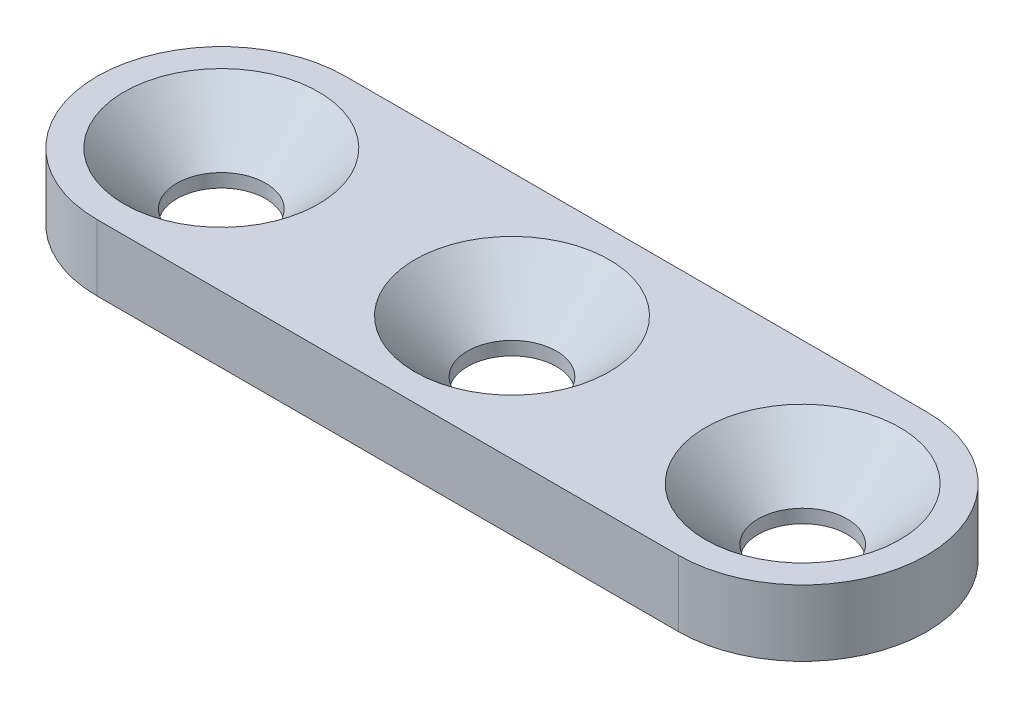
ISO-10303-21;
HEADER;
FILE_DESCRIPTION(('STEP AP214'),'2;1');
FILE_NAME('part.step','',(''),(''),'','','');
FILE_SCHEMA(('AUTOMOTIVE_DESIGN { 1 0 10303 214 1 1 1 1 }'));
ENDSEC;
DATA;
#1=APPLICATION_CONTEXT('core data for automotive mechanical design processes');
#2=APPLICATION_PROTOCOL_DEFINITION('international standard','automotive_design',2000,#1);
#3=PRODUCT_CONTEXT('',#1,'mechanical');
#4=PRODUCT('Part','Part','',(#3));
#5=PRODUCT_RELATED_PRODUCT_CATEGORY('part','',(#4));
#6=PRODUCT_DEFINITION_FORMATION('','',#4);
#7=PRODUCT_DEFINITION_CONTEXT('part definition',#1,'design');
#8=PRODUCT_DEFINITION('design','',#6,#7);
#9=PRODUCT_DEFINITION_SHAPE('','',#8);
#10=(LENGTH_UNIT() NAMED_UNIT(*) SI_UNIT(.MILLI.,.METRE.));
#11=(NAMED_UNIT(*) PLANE_ANGLE_UNIT() SI_UNIT($,.RADIAN.));
#12=(NAMED_UNIT(*) SI_UNIT($,.STERADIAN.) SOLID_ANGLE_UNIT());
#13=UNCERTAINTY_MEASURE_WITH_UNIT(LENGTH_MEASURE(1.E-05),#10,'distance_accuracy_value','');
#14=(GEOMETRIC_REPRESENTATION_CONTEXT(3) GLOBAL_UNCERTAINTY_ASSIGNED_CONTEXT((#13)) GLOBAL_UNIT_ASSIGNED_CONTEXT((#10,
#11,#12)) REPRESENTATION_CONTEXT('',''));
#15=CARTESIAN_POINT('',(0.,0.,0.));
#16=DIRECTION('',(0.,0.,1.));
#17=DIRECTION('',(1.,0.,0.));
#18=AXIS2_PLACEMENT_3D('',#15,#16,#17);
#19=CARTESIAN_POINT('',(14.05,0.,0.));
#20=DIRECTION('',(0.,-1.,0.));
#21=DIRECTION('',(0.,0.,-1.));
#22=AXIS2_PLACEMENT_3D('',#19,#20,#21);
#23=PLANE('',#22);
#24=CARTESIAN_POINT('',(14.05,0.,0.));
#25=DIRECTION('',(0.,1.,0.));
#26=DIRECTION('',(0.,0.,-1.));
#27=AXIS2_PLACEMENT_3D('',#24,#25,#26);
#28=CIRCLE('',#27,6.);
#29=CARTESIAN_POINT('',(14.05,0.,6.));
#30=VERTEX_POINT('',#29);
#31=CARTESIAN_POINT('',(14.05,0.,-6.));
#32=VERTEX_POINT('',#31);
#33=EDGE_CURVE('E126',#30,#32,#28,.T.);
#34=ORIENTED_EDGE('',*,*,#33,.F.);
#35=DIRECTION('',(1.,0.,0.));
#36=VECTOR('',#35,1.);
#37=CARTESIAN_POINT('',(-14.05,0.,6.));
#38=LINE('',#37,#36);
#39=CARTESIAN_POINT('',(-14.05,0.,6.));
#40=VERTEX_POINT('',#39);
#41=EDGE_CURVE('E98',#40,#30,#38,.T.);
#42=ORIENTED_EDGE('',*,*,#41,.F.);
#43=CARTESIAN_POINT('',(-14.05,0.,0.));
#44=DIRECTION('',(0.,1.,0.));
#45=DIRECTION('',(0.,0.,1.));
#46=AXIS2_PLACEMENT_3D('',#43,#44,#45);
#47=CIRCLE('',#46,6.);
#48=CARTESIAN_POINT('',(-14.05,0.,-6.));
#49=VERTEX_POINT('',#48);
#50=EDGE_CURVE('E92',#49,#40,#47,.T.);
#51=ORIENTED_EDGE('',*,*,#50,.F.);
#52=DIRECTION('',(-1.,0.,0.));
#53=VECTOR('',#52,1.);
#54=CARTESIAN_POINT('',(-14.05,0.,-6.));
#55=LINE('',#54,#53);
#56=EDGE_CURVE('E115',#32,#49,#55,.T.);
#57=ORIENTED_EDGE('',*,*,#56,.F.);
#58=EDGE_LOOP('',(#34,#42,#51,#57));
#59=FACE_BOUND('',#58,.T.);
#60=CARTESIAN_POINT('',(-14.05,0.,0.));
#61=DIRECTION('',(0.,1.,0.));
#62=DIRECTION('',(0.,0.,1.));
#63=AXIS2_PLACEMENT_3D('',#60,#61,#62);
#64=CIRCLE('',#63,2.15);
#65=CARTESIAN_POINT('',(-14.05,0.,2.15));
#66=VERTEX_POINT('',#65);
#67=EDGE_CURVE('E130',#66,#66,#64,.T.);
#68=ORIENTED_EDGE('',*,*,#67,.T.);
#69=EDGE_LOOP('',(#68));
#70=FACE_BOUND('',#69,.T.);
#71=CARTESIAN_POINT('',(14.05,0.,0.));
#72=DIRECTION('',(0.,1.,0.));
#73=DIRECTION('',(0.,0.,1.));
#74=AXIS2_PLACEMENT_3D('',#71,#72,#73);
#75=CIRCLE('',#74,2.15);
#76=CARTESIAN_POINT('',(14.05,0.,2.15));
#77=VERTEX_POINT('',#76);
#78=EDGE_CURVE('E158',#77,#77,#75,.T.);
#79=ORIENTED_EDGE('',*,*,#78,.T.);
#80=EDGE_LOOP('',(#79));
#81=FACE_BOUND('',#80,.T.);
#82=CARTESIAN_POINT('',(0.,0.,0.));
#83=DIRECTION('',(0.,1.,0.));
#84=DIRECTION('',(0.,0.,1.));
#85=AXIS2_PLACEMENT_3D('',#82,#83,#84);
#86=CIRCLE('',#85,2.15);
#87=CARTESIAN_POINT('',(0.,0.,2.15));
#88=VERTEX_POINT('',#87);
#89=EDGE_CURVE('E170',#88,#88,#86,.T.);
#90=ORIENTED_EDGE('',*,*,#89,.T.);
#91=EDGE_LOOP('',(#90));
#92=FACE_BOUND('',#91,.T.);
#93=ADVANCED_FACE('F57',(#59,#70,#81,#92),#23,.T.);
#94=CARTESIAN_POINT('',(14.05,3.2,0.));
#95=DIRECTION('',(0.,-1.,0.));
#96=DIRECTION('',(0.,0.,-1.));
#97=AXIS2_PLACEMENT_3D('',#94,#95,#96);
#98=CYLINDRICAL_SURFACE('',#97,6.);
#99=ORIENTED_EDGE('',*,*,#33,.T.);
#100=DIRECTION('',(0.,-1.,0.));
#101=VECTOR('',#100,1.);
#102=CARTESIAN_POINT('',(14.05,3.2,-6.));
#103=LINE('',#102,#101);
#104=CARTESIAN_POINT('',(14.05,3.2,-6.));
#105=VERTEX_POINT('',#104);
#106=EDGE_CURVE('E13',#105,#32,#103,.T.);
#107=ORIENTED_EDGE('',*,*,#106,.F.);
#108=CARTESIAN_POINT('',(14.05,3.2,0.));
#109=DIRECTION('',(0.,1.,0.));
#110=DIRECTION('',(0.,0.,-1.));
#111=AXIS2_PLACEMENT_3D('',#108,#109,#110);
#112=CIRCLE('',#111,6.);
#113=CARTESIAN_POINT('',(14.05,3.2,6.));
#114=VERTEX_POINT('',#113);
#115=EDGE_CURVE('E110',#114,#105,#112,.T.);
#116=ORIENTED_EDGE('',*,*,#115,.F.);
#117=DIRECTION('',(0.,-1.,0.));
#118=VECTOR('',#117,1.);
#119=CARTESIAN_POINT('',(14.05,3.2,6.));
#120=LINE('',#119,#118);
#121=EDGE_CURVE('E122',#114,#30,#120,.T.);
#122=ORIENTED_EDGE('',*,*,#121,.T.);
#123=EDGE_LOOP('',(#99,#107,#116,#122));
#124=FACE_BOUND('',#123,.T.);
#125=ADVANCED_FACE('F59',(#124),#98,.T.);
#126=CARTESIAN_POINT('',(-14.05,3.2,-6.));
#127=DIRECTION('',(0.,0.,1.));
#128=DIRECTION('',(1.,0.,0.));
#129=AXIS2_PLACEMENT_3D('',#126,#127,#128);
#130=PLANE('',#129);
#131=ORIENTED_EDGE('',*,*,#56,.T.);
#132=DIRECTION('',(0.,-1.,0.));
#133=VECTOR('',#132,1.);
#134=CARTESIAN_POINT('',(-14.05,3.2,-6.));
#135=LINE('',#134,#133);
#136=CARTESIAN_POINT('',(-14.05,3.2,-6.));
#137=VERTEX_POINT('',#136);
#138=EDGE_CURVE('E67',#137,#49,#135,.T.);
#139=ORIENTED_EDGE('',*,*,#138,.F.);
#140=DIRECTION('',(-1.,0.,0.));
#141=VECTOR('',#140,1.);
#142=CARTESIAN_POINT('',(-14.05,3.2,-6.));
#143=LINE('',#142,#141);
#144=EDGE_CURVE('E105',#105,#137,#143,.T.);
#145=ORIENTED_EDGE('',*,*,#144,.F.);
#146=ORIENTED_EDGE('',*,*,#106,.T.);
#147=EDGE_LOOP('',(#131,#139,#145,#146));
#148=FACE_BOUND('',#147,.T.);
#149=ADVANCED_FACE('F114',(#148),#130,.F.);
#150=CARTESIAN_POINT('',(-14.05,3.2,0.));
#151=DIRECTION('',(0.,-1.,0.));
#152=DIRECTION('',(0.,0.,-1.));
#153=AXIS2_PLACEMENT_3D('',#150,#151,#152);
#154=CYLINDRICAL_SURFACE('',#153,6.);
#155=ORIENTED_EDGE('',*,*,#50,.T.);
#156=DIRECTION('',(0.,-1.,0.));
#157=VECTOR('',#156,1.);
#158=CARTESIAN_POINT('',(-14.05,3.2,6.));
#159=LINE('',#158,#157);
#160=CARTESIAN_POINT('',(-14.05,3.2,6.));
#161=VERTEX_POINT('',#160);
#162=EDGE_CURVE('E117',#161,#40,#159,.T.);
#163=ORIENTED_EDGE('',*,*,#162,.F.);
#164=CARTESIAN_POINT('',(-14.05,3.2,0.));
#165=DIRECTION('',(0.,1.,0.));
#166=DIRECTION('',(0.,0.,1.));
#167=AXIS2_PLACEMENT_3D('',#164,#165,#166);
#168=CIRCLE('',#167,6.);
#169=EDGE_CURVE('E108',#137,#161,#168,.T.);
#170=ORIENTED_EDGE('',*,*,#169,.F.);
#171=ORIENTED_EDGE('',*,*,#138,.T.);
#172=EDGE_LOOP('',(#155,#163,#170,#171));
#173=FACE_BOUND('',#172,.T.);
#174=ADVANCED_FACE('F118',(#173),#154,.T.);
#175=CARTESIAN_POINT('',(-14.05,3.2,6.));
#176=DIRECTION('',(0.,0.,-1.));
#177=DIRECTION('',(-1.,0.,0.));
#178=AXIS2_PLACEMENT_3D('',#175,#176,#177);
#179=PLANE('',#178);
#180=ORIENTED_EDGE('',*,*,#41,.T.);
#181=ORIENTED_EDGE('',*,*,#121,.F.);
#182=DIRECTION('',(1.,0.,0.));
#183=VECTOR('',#182,1.);
#184=CARTESIAN_POINT('',(-14.05,3.2,6.));
#185=LINE('',#184,#183);
#186=EDGE_CURVE('E75',#161,#114,#185,.T.);
#187=ORIENTED_EDGE('',*,*,#186,.F.);
#188=ORIENTED_EDGE('',*,*,#162,.T.);
#189=EDGE_LOOP('',(#180,#181,#187,#188));
#190=FACE_BOUND('',#189,.T.);
#191=ADVANCED_FACE('F140',(#190),#179,.F.);
#192=CARTESIAN_POINT('',(14.05,3.2,0.));
#193=DIRECTION('',(0.,-1.,0.));
#194=DIRECTION('',(0.,0.,-1.));
#195=AXIS2_PLACEMENT_3D('',#192,#193,#194);
#196=PLANE('',#195);
#197=CARTESIAN_POINT('',(0.,3.2,0.));
#198=DIRECTION('',(0.,1.,0.));
#199=DIRECTION('',(0.,0.,1.));
#200=AXIS2_PLACEMENT_3D('',#197,#198,#199);
#201=CIRCLE('',#200,4.7);
#202=CARTESIAN_POINT('',(0.,3.2,4.7));
#203=VERTEX_POINT('',#202);
#204=EDGE_CURVE('E178',#203,#203,#201,.T.);
#205=ORIENTED_EDGE('',*,*,#204,.F.);
#206=EDGE_LOOP('',(#205));
#207=FACE_BOUND('',#206,.T.);
#208=CARTESIAN_POINT('',(14.05,3.2,0.));
#209=DIRECTION('',(0.,1.,0.));
#210=DIRECTION('',(0.,0.,1.));
#211=AXIS2_PLACEMENT_3D('',#208,#209,#210);
#212=CIRCLE('',#211,4.7);
#213=CARTESIAN_POINT('',(14.05,3.2,4.7));
#214=VERTEX_POINT('',#213);
#215=EDGE_CURVE('E166',#214,#214,#212,.T.);
#216=ORIENTED_EDGE('',*,*,#215,.F.);
#217=EDGE_LOOP('',(#216));
#218=FACE_BOUND('',#217,.T.);
#219=CARTESIAN_POINT('',(-14.05,3.2,0.));
#220=DIRECTION('',(0.,1.,0.));
#221=DIRECTION('',(0.,0.,1.));
#222=AXIS2_PLACEMENT_3D('',#219,#220,#221);
#223=CIRCLE('',#222,4.7);
#224=CARTESIAN_POINT('',(-14.05,3.2,4.7));
#225=VERTEX_POINT('',#224);
#226=EDGE_CURVE('E154',#225,#225,#223,.T.);
#227=ORIENTED_EDGE('',*,*,#226,.F.);
#228=EDGE_LOOP('',(#227));
#229=FACE_BOUND('',#228,.T.);
#230=ORIENTED_EDGE('',*,*,#115,.T.);
#231=ORIENTED_EDGE('',*,*,#144,.T.);
#232=ORIENTED_EDGE('',*,*,#169,.T.);
#233=ORIENTED_EDGE('',*,*,#186,.T.);
#234=EDGE_LOOP('',(#230,#231,#232,#233));
#235=FACE_BOUND('',#234,.T.);
#236=ADVANCED_FACE('F106',(#207,#218,#229,#235),#196,.F.);
#237=CARTESIAN_POINT('',(-14.05,3.2,0.));
#238=DIRECTION('',(0.,1.,0.));
#239=DIRECTION('',(0.,0.,1.));
#240=AXIS2_PLACEMENT_3D('',#237,#238,#239);
#241=CYLINDRICAL_SURFACE('',#240,2.15);
#242=CARTESIAN_POINT('',(-14.05,0.650000000000001,0.));
#243=DIRECTION('',(0.,1.,0.));
#244=DIRECTION('',(0.,0.,1.));
#245=AXIS2_PLACEMENT_3D('',#242,#243,#244);
#246=CIRCLE('',#245,2.15);
#247=CARTESIAN_POINT('',(-14.05,0.650000000000002,2.15));
#248=VERTEX_POINT('',#247);
#249=EDGE_CURVE('E150',#248,#248,#246,.T.);
#250=CARTESIAN_POINT('',(-14.05,0.,2.15));
#251=CARTESIAN_POINT('',(-14.05,0.0067708333333333,2.15));
#252=CARTESIAN_POINT('',(-14.05,0.0135416666666666,2.15));
#253=CARTESIAN_POINT('',(-14.05,0.0270833333333334,2.15));
#254=CARTESIAN_POINT('',(-14.05,0.0338541666666668,2.15));
#255=CARTESIAN_POINT('',(-14.05,0.0473958333333336,2.15));
#256=CARTESIAN_POINT('',(-14.05,0.0541666666666669,2.15));
#257=CARTESIAN_POINT('',(-14.05,0.0677083333333335,2.15));
#258=CARTESIAN_POINT('',(-14.05,0.0744791666666668,2.15));
#259=CARTESIAN_POINT('',(-14.05,0.0880208333333336,2.15));
#260=CARTESIAN_POINT('',(-14.05,0.0947916666666671,2.15));
#261=CARTESIAN_POINT('',(-14.05,0.108333333333334,2.15));
#262=CARTESIAN_POINT('',(-14.05,0.115104166666667,2.15));
#263=CARTESIAN_POINT('',(-14.05,0.128645833333334,2.15));
#264=CARTESIAN_POINT('',(-14.05,0.135416666666667,2.15));
#265=CARTESIAN_POINT('',(-14.05,0.148958333333334,2.15));
#266=CARTESIAN_POINT('',(-14.05,0.155729166666667,2.15));
#267=CARTESIAN_POINT('',(-14.05,0.169270833333334,2.15));
#268=CARTESIAN_POINT('',(-14.05,0.176041666666667,2.15));
#269=CARTESIAN_POINT('',(-14.05,0.189583333333334,2.15));
#270=CARTESIAN_POINT('',(-14.05,0.196354166666667,2.15));
#271=CARTESIAN_POINT('',(-14.05,0.209895833333334,2.15));
#272=CARTESIAN_POINT('',(-14.05,0.216666666666667,2.15));
#273=CARTESIAN_POINT('',(-14.05,0.230208333333334,2.15));
#274=CARTESIAN_POINT('',(-14.05,0.236979166666667,2.15));
#275=CARTESIAN_POINT('',(-14.05,0.250520833333334,2.15));
#276=CARTESIAN_POINT('',(-14.05,0.257291666666668,2.15));
#277=CARTESIAN_POINT('',(-14.05,0.270833333333334,2.15));
#278=CARTESIAN_POINT('',(-14.05,0.277604166666667,2.15));
#279=CARTESIAN_POINT('',(-14.05,0.291145833333334,2.15));
#280=CARTESIAN_POINT('',(-14.05,0.297916666666667,2.15));
#281=CARTESIAN_POINT('',(-14.05,0.311458333333334,2.15));
#282=CARTESIAN_POINT('',(-14.05,0.318229166666667,2.15));
#283=CARTESIAN_POINT('',(-14.05,0.331770833333334,2.15));
#284=CARTESIAN_POINT('',(-14.05,0.338541666666667,2.15));
#285=CARTESIAN_POINT('',(-14.05,0.352083333333334,2.15));
#286=CARTESIAN_POINT('',(-14.05,0.358854166666667,2.15));
#287=CARTESIAN_POINT('',(-14.05,0.372395833333334,2.15));
#288=CARTESIAN_POINT('',(-14.05,0.379166666666668,2.15));
#289=CARTESIAN_POINT('',(-14.05,0.392708333333334,2.15));
#290=CARTESIAN_POINT('',(-14.05,0.399479166666667,2.15));
#291=CARTESIAN_POINT('',(-14.05,0.413020833333334,2.15));
#292=CARTESIAN_POINT('',(-14.05,0.419791666666668,2.15));
#293=CARTESIAN_POINT('',(-14.05,0.433333333333334,2.15));
#294=CARTESIAN_POINT('',(-14.05,0.440104166666668,2.15));
#295=CARTESIAN_POINT('',(-14.05,0.453645833333334,2.15));
#296=CARTESIAN_POINT('',(-14.05,0.460416666666668,2.15));
#297=CARTESIAN_POINT('',(-14.05,0.473958333333334,2.15));
#298=CARTESIAN_POINT('',(-14.05,0.480729166666668,2.15));
#299=CARTESIAN_POINT('',(-14.05,0.494270833333335,2.15));
#300=CARTESIAN_POINT('',(-14.05,0.501041666666668,2.15));
#301=CARTESIAN_POINT('',(-14.05,0.514583333333335,2.15));
#302=CARTESIAN_POINT('',(-14.05,0.521354166666668,2.15));
#303=CARTESIAN_POINT('',(-14.05,0.534895833333335,2.15));
#304=CARTESIAN_POINT('',(-14.05,0.541666666666668,2.15));
#305=CARTESIAN_POINT('',(-14.05,0.555208333333335,2.15));
#306=CARTESIAN_POINT('',(-14.05,0.561979166666668,2.15));
#307=CARTESIAN_POINT('',(-14.05,0.575520833333335,2.15));
#308=CARTESIAN_POINT('',(-14.05,0.582291666666668,2.15));
#309=CARTESIAN_POINT('',(-14.05,0.595833333333335,2.15));
#310=CARTESIAN_POINT('',(-14.05,0.602604166666668,2.15));
#311=CARTESIAN_POINT('',(-14.05,0.616145833333335,2.15));
#312=CARTESIAN_POINT('',(-14.05,0.622916666666668,2.15));
#313=CARTESIAN_POINT('',(-14.05,0.636458333333335,2.15));
#314=CARTESIAN_POINT('',(-14.05,0.643229166666668,2.15));
#315=CARTESIAN_POINT('',(-14.05,0.650000000000002,2.15));
#316=B_SPLINE_CURVE_WITH_KNOTS('',3,(#250,#251,#252,#253,#254,#255,#256,#257,#258,#259,#260,
#261,#262,#263,#264,#265,#266,#267,#268,#269,#270,#271,#272,#273,#274,#275,#276,#277,#278,#279,
#280,#281,#282,#283,#284,#285,#286,#287,#288,#289,#290,#291,#292,#293,#294,#295,#296,#297,#298,
#299,#300,#301,#302,#303,#304,#305,#306,#307,#308,#309,#310,#311,#312,#313,#314,#315),
.UNSPECIFIED.,.F.,.F.,(4,2,2,2,2,2,2,2,2,2,2,2,2,2,2,2,2,2,2,2,2,2,2,2,2,2,2,2,2,2,2,2,4),(0.,
0.0203124999999999,0.0406250000000003,0.0609375000000002,0.0812500000000002,0.101562500000001,
0.121875,0.1421875,0.1625,0.182812500000001,0.203125000000001,0.223437500000001,
0.243750000000001,0.264062500000001,0.284375,0.304687500000001,0.325000000000001,
0.345312500000001,0.365625000000001,0.385937500000001,0.406250000000001,0.426562500000001,
0.446875000000001,0.467187500000001,0.487500000000001,0.507812500000001,0.528125000000001,
0.548437500000002,0.568750000000002,0.589062500000001,0.609375000000002,0.629687500000002,
0.650000000000002),.UNSPECIFIED.);
#317=EDGE_CURVE('BSEAM187',#66,#248,#316,.T.);
#318=ORIENTED_EDGE('',*,*,#67,.F.);
#319=ORIENTED_EDGE('',*,*,#249,.T.);
#320=ORIENTED_EDGE('',*,*,#317,.T.);
#321=ORIENTED_EDGE('',*,*,#317,.F.);
#322=EDGE_LOOP('',(#318,#320,#319,#321));
#323=FACE_BOUND('',#322,.T.);
#324=ADVANCED_FACE('F187',(#323),#241,.F.);
#325=CARTESIAN_POINT('',(-14.05,3.2,0.));
#326=DIRECTION('',(0.,1.,0.));
#327=DIRECTION('',(0.,0.,1.));
#328=AXIS2_PLACEMENT_3D('',#325,#326,#327);
#329=CONICAL_SURFACE('',#328,4.7,0.785398163397448);
#330=CARTESIAN_POINT('',(-14.05,0.650000000000002,2.15));
#331=CARTESIAN_POINT('',(-14.05,0.676562500000002,2.1765625));
#332=CARTESIAN_POINT('',(-14.05,0.703125000000002,2.203125));
#333=CARTESIAN_POINT('',(-14.05,0.756250000000002,2.25625));
#334=CARTESIAN_POINT('',(-14.05,0.782812500000001,2.2828125));
#335=CARTESIAN_POINT('',(-14.05,0.835937500000002,2.3359375));
#336=CARTESIAN_POINT('',(-14.05,0.862500000000001,2.3625));
#337=CARTESIAN_POINT('',(-14.05,0.915625000000001,2.415625));
#338=CARTESIAN_POINT('',(-14.05,0.942187500000001,2.4421875));
#339=CARTESIAN_POINT('',(-14.05,0.995312500000001,2.4953125));
#340=CARTESIAN_POINT('',(-14.05,1.021875,2.521875));
#341=CARTESIAN_POINT('',(-14.05,1.075,2.575));
#342=CARTESIAN_POINT('',(-14.05,1.1015625,2.6015625));
#343=CARTESIAN_POINT('',(-14.05,1.1546875,2.6546875));
#344=CARTESIAN_POINT('',(-14.05,1.18125,2.68125));
#345=CARTESIAN_POINT('',(-14.05,1.234375,2.734375));
#346=CARTESIAN_POINT('',(-14.05,1.2609375,2.7609375));
#347=CARTESIAN_POINT('',(-14.05,1.3140625,2.8140625));
#348=CARTESIAN_POINT('',(-14.05,1.340625,2.840625));
#349=CARTESIAN_POINT('',(-14.05,1.39375,2.89375));
#350=CARTESIAN_POINT('',(-14.05,1.4203125,2.9203125));
#351=CARTESIAN_POINT('',(-14.05,1.4734375,2.9734375));
#352=CARTESIAN_POINT('',(-14.05,1.5,3.));
#353=CARTESIAN_POINT('',(-14.05,1.553125,3.053125));
#354=CARTESIAN_POINT('',(-14.05,1.5796875,3.0796875));
#355=CARTESIAN_POINT('',(-14.05,1.6328125,3.1328125));
#356=CARTESIAN_POINT('',(-14.05,1.659375,3.159375));
#357=CARTESIAN_POINT('',(-14.05,1.7125,3.2125));
#358=CARTESIAN_POINT('',(-14.05,1.7390625,3.2390625));
#359=CARTESIAN_POINT('',(-14.05,1.7921875,3.2921875));
#360=CARTESIAN_POINT('',(-14.05,1.81875,3.31875));
#361=CARTESIAN_POINT('',(-14.05,1.871875,3.371875));
#362=CARTESIAN_POINT('',(-14.05,1.8984375,3.3984375));
#363=CARTESIAN_POINT('',(-14.05,1.9515625,3.4515625));
#364=CARTESIAN_POINT('',(-14.05,1.978125,3.478125));
#365=CARTESIAN_POINT('',(-14.05,2.03125,3.53125));
#366=CARTESIAN_POINT('',(-14.05,2.0578125,3.5578125));
#367=CARTESIAN_POINT('',(-14.05,2.1109375,3.6109375));
#368=CARTESIAN_POINT('',(-14.05,2.1375,3.6375));
#369=CARTESIAN_POINT('',(-14.05,2.190625,3.690625));
#370=CARTESIAN_POINT('',(-14.05,2.2171875,3.7171875));
#371=CARTESIAN_POINT('',(-14.05,2.2703125,3.7703125));
#372=CARTESIAN_POINT('',(-14.05,2.296875,3.796875));
#373=CARTESIAN_POINT('',(-14.05,2.35,3.85));
#374=CARTESIAN_POINT('',(-14.05,2.3765625,3.8765625));
#375=CARTESIAN_POINT('',(-14.05,2.4296875,3.9296875));
#376=CARTESIAN_POINT('',(-14.05,2.45625,3.95625));
#377=CARTESIAN_POINT('',(-14.05,2.509375,4.009375));
#378=CARTESIAN_POINT('',(-14.05,2.5359375,4.0359375));
#379=CARTESIAN_POINT('',(-14.05,2.5890625,4.0890625));
#380=CARTESIAN_POINT('',(-14.05,2.615625,4.115625));
#381=CARTESIAN_POINT('',(-14.05,2.66875,4.16875));
#382=CARTESIAN_POINT('',(-14.05,2.6953125,4.1953125));
#383=CARTESIAN_POINT('',(-14.05,2.7484375,4.2484375));
#384=CARTESIAN_POINT('',(-14.05,2.775,4.275));
#385=CARTESIAN_POINT('',(-14.05,2.828125,4.328125));
#386=CARTESIAN_POINT('',(-14.05,2.8546875,4.3546875));
#387=CARTESIAN_POINT('',(-14.05,2.9078125,4.4078125));
#388=CARTESIAN_POINT('',(-14.05,2.934375,4.434375));
#389=CARTESIAN_POINT('',(-14.05,2.9875,4.4875));
#390=CARTESIAN_POINT('',(-14.05,3.0140625,4.5140625));
#391=CARTESIAN_POINT('',(-14.05,3.0671875,4.5671875));
#392=CARTESIAN_POINT('',(-14.05,3.09375,4.59375));
#393=CARTESIAN_POINT('',(-14.05,3.146875,4.646875));
#394=CARTESIAN_POINT('',(-14.05,3.1734375,4.6734375));
#395=CARTESIAN_POINT('',(-14.05,3.2,4.7));
#396=B_SPLINE_CURVE_WITH_KNOTS('',3,(#330,#331,#332,#333,#334,#335,#336,#337,#338,#339,#340,
#341,#342,#343,#344,#345,#346,#347,#348,#349,#350,#351,#352,#353,#354,#355,#356,#357,#358,#359,
#360,#361,#362,#363,#364,#365,#366,#367,#368,#369,#370,#371,#372,#373,#374,#375,#376,#377,#378,
#379,#380,#381,#382,#383,#384,#385,#386,#387,#388,#389,#390,#391,#392,#393,#394,#395),
.UNSPECIFIED.,.F.,.F.,(4,2,2,2,2,2,2,2,2,2,2,2,2,2,2,2,2,2,2,2,2,2,2,2,2,2,2,2,2,2,2,2,4),(0.,
0.112695143251606,0.225390286503212,0.338085429754818,0.450780573006423,0.563475716258029,
0.676170859509635,0.788866002761241,0.901561146012846,1.01425628926445,1.12695143251606,
1.23964657576766,1.35234171901927,1.46503686227087,1.57773200552248,1.69042714877409,
1.80312229202569,1.9158174352773,2.0285125785289,2.14120772178051,2.25390286503212,
2.36659800828372,2.47929315153533,2.59198829478693,2.70468343803854,2.81737858129014,
2.93007372454175,3.04276886779336,3.15546401104496,3.26815915429657,3.38085429754817,
3.49354944079978,3.60624458405138),.UNSPECIFIED.);
#397=EDGE_CURVE('BSEAM193',#248,#225,#396,.T.);
#398=ORIENTED_EDGE('',*,*,#249,.F.);
#399=ORIENTED_EDGE('',*,*,#226,.T.);
#400=ORIENTED_EDGE('',*,*,#397,.T.);
#401=ORIENTED_EDGE('',*,*,#397,.F.);
#402=EDGE_LOOP('',(#398,#400,#399,#401));
#403=FACE_BOUND('',#402,.T.);
#404=ADVANCED_FACE('F193',(#403),#329,.F.);
#405=CARTESIAN_POINT('',(14.05,3.2,0.));
#406=DIRECTION('',(0.,1.,0.));
#407=DIRECTION('',(0.,0.,1.));
#408=AXIS2_PLACEMENT_3D('',#405,#406,#407);
#409=CYLINDRICAL_SURFACE('',#408,2.15);
#410=CARTESIAN_POINT('',(14.05,0.650000000000001,0.));
#411=DIRECTION('',(0.,1.,0.));
#412=DIRECTION('',(0.,0.,1.));
#413=AXIS2_PLACEMENT_3D('',#410,#411,#412);
#414=CIRCLE('',#413,2.15);
#415=CARTESIAN_POINT('',(14.05,0.650000000000002,2.15));
#416=VERTEX_POINT('',#415);
#417=EDGE_CURVE('E162',#416,#416,#414,.T.);
#418=CARTESIAN_POINT('',(14.05,0.,2.15));
#419=CARTESIAN_POINT('',(14.05,0.00677083333332651,2.15));
#420=CARTESIAN_POINT('',(14.05,0.01354166666666,2.15));
#421=CARTESIAN_POINT('',(14.05,0.0270833333333269,2.15));
#422=CARTESIAN_POINT('',(14.05,0.0338541666666603,2.15));
#423=CARTESIAN_POINT('',(14.05,0.0473958333333271,2.15));
#424=CARTESIAN_POINT('',(14.05,0.0541666666666604,2.15));
#425=CARTESIAN_POINT('',(14.05,0.0677083333333272,2.15));
#426=CARTESIAN_POINT('',(14.05,0.0744791666666606,2.15));
#427=CARTESIAN_POINT('',(14.05,0.0880208333333275,2.15));
#428=CARTESIAN_POINT('',(14.05,0.094791666666661,2.15));
#429=CARTESIAN_POINT('',(14.05,0.108333333333328,2.15));
#430=CARTESIAN_POINT('',(14.05,0.115104166666661,2.15));
#431=CARTESIAN_POINT('',(14.05,0.128645833333328,2.15));
#432=CARTESIAN_POINT('',(14.05,0.135416666666662,2.15));
#433=CARTESIAN_POINT('',(14.05,0.148958333333329,2.15));
#434=CARTESIAN_POINT('',(14.05,0.155729166666662,2.15));
#435=CARTESIAN_POINT('',(14.05,0.169270833333329,2.15));
#436=CARTESIAN_POINT('',(14.05,0.176041666666662,2.15));
#437=CARTESIAN_POINT('',(14.05,0.189583333333329,2.15));
#438=CARTESIAN_POINT('',(14.05,0.196354166666662,2.15));
#439=CARTESIAN_POINT('',(14.05,0.209895833333329,2.15));
#440=CARTESIAN_POINT('',(14.05,0.216666666666663,2.15));
#441=CARTESIAN_POINT('',(14.05,0.23020833333333,2.15));
#442=CARTESIAN_POINT('',(14.05,0.236979166666663,2.15));
#443=CARTESIAN_POINT('',(14.05,0.25052083333333,2.15));
#444=CARTESIAN_POINT('',(14.05,0.257291666666663,2.15));
#445=CARTESIAN_POINT('',(14.05,0.27083333333333,2.15));
#446=CARTESIAN_POINT('',(14.05,0.277604166666663,2.15));
#447=CARTESIAN_POINT('',(14.05,0.29114583333333,2.15));
#448=CARTESIAN_POINT('',(14.05,0.297916666666663,2.15));
#449=CARTESIAN_POINT('',(14.05,0.31145833333333,2.15));
#450=CARTESIAN_POINT('',(14.05,0.318229166666664,2.15));
#451=CARTESIAN_POINT('',(14.05,0.331770833333331,2.15));
#452=CARTESIAN_POINT('',(14.05,0.338541666666664,2.15));
#453=CARTESIAN_POINT('',(14.05,0.352083333333331,2.15));
#454=CARTESIAN_POINT('',(14.05,0.358854166666664,2.15));
#455=CARTESIAN_POINT('',(14.05,0.372395833333331,2.15));
#456=CARTESIAN_POINT('',(14.05,0.379166666666665,2.15));
#457=CARTESIAN_POINT('',(14.05,0.392708333333331,2.15));
#458=CARTESIAN_POINT('',(14.05,0.399479166666665,2.15));
#459=CARTESIAN_POINT('',(14.05,0.413020833333332,2.15));
#460=CARTESIAN_POINT('',(14.05,0.419791666666665,2.15));
#461=CARTESIAN_POINT('',(14.05,0.433333333333332,2.15));
#462=CARTESIAN_POINT('',(14.05,0.440104166666665,2.15));
#463=CARTESIAN_POINT('',(14.05,0.453645833333332,2.15));
#464=CARTESIAN_POINT('',(14.05,0.460416666666666,2.15));
#465=CARTESIAN_POINT('',(14.05,0.473958333333333,2.15));
#466=CARTESIAN_POINT('',(14.05,0.480729166666666,2.15));
#467=CARTESIAN_POINT('',(14.05,0.494270833333333,2.15));
#468=CARTESIAN_POINT('',(14.05,0.501041666666666,2.15));
#469=CARTESIAN_POINT('',(14.05,0.514583333333333,2.15));
#470=CARTESIAN_POINT('',(14.05,0.521354166666666,2.15));
#471=CARTESIAN_POINT('',(14.05,0.534895833333333,2.15));
#472=CARTESIAN_POINT('',(14.05,0.541666666666667,2.15));
#473=CARTESIAN_POINT('',(14.05,0.555208333333334,2.15));
#474=CARTESIAN_POINT('',(14.05,0.561979166666667,2.15));
#475=CARTESIAN_POINT('',(14.05,0.575520833333334,2.15));
#476=CARTESIAN_POINT('',(14.05,0.582291666666667,2.15));
#477=CARTESIAN_POINT('',(14.05,0.595833333333334,2.15));
#478=CARTESIAN_POINT('',(14.05,0.602604166666667,2.15));
#479=CARTESIAN_POINT('',(14.05,0.616145833333334,2.15));
#480=CARTESIAN_POINT('',(14.05,0.622916666666668,2.15));
#481=CARTESIAN_POINT('',(14.05,0.636458333333335,2.15));
#482=CARTESIAN_POINT('',(14.05,0.643229166666668,2.15));
#483=CARTESIAN_POINT('',(14.05,0.650000000000002,2.15));
#484=B_SPLINE_CURVE_WITH_KNOTS('',3,(#418,#419,#420,#421,#422,#423,#424,#425,#426,#427,#428,
#429,#430,#431,#432,#433,#434,#435,#436,#437,#438,#439,#440,#441,#442,#443,#444,#445,#446,#447,
#448,#449,#450,#451,#452,#453,#454,#455,#456,#457,#458,#459,#460,#461,#462,#463,#464,#465,#466,
#467,#468,#469,#470,#471,#472,#473,#474,#475,#476,#477,#478,#479,#480,#481,#482,#483),
.UNSPECIFIED.,.F.,.F.,(4,2,2,2,2,2,2,2,2,2,2,2,2,2,2,2,2,2,2,2,2,2,2,2,2,2,2,2,2,2,2,2,4),(0.,
0.0203125000000004,0.0406250000000007,0.0609375000000007,0.081250000000001,0.101562500000001,
0.121875000000002,0.142187500000002,0.162500000000002,0.182812500000002,0.203125000000003,
0.223437500000003,0.243750000000004,0.264062500000004,0.284375000000003,0.304687500000004,
0.325000000000004,0.345312500000004,0.365625000000005,0.385937500000005,0.406250000000005,
0.426562500000006,0.446875000000006,0.467187500000006,0.487500000000007,0.507812500000007,
0.528125000000007,0.548437500000007,0.568750000000008,0.589062500000008,0.609375000000008,
0.629687500000008,0.650000000000009),.UNSPECIFIED.);
#485=EDGE_CURVE('BSEAM195',#77,#416,#484,.T.);
#486=ORIENTED_EDGE('',*,*,#78,.F.);
#487=ORIENTED_EDGE('',*,*,#417,.T.);
#488=ORIENTED_EDGE('',*,*,#485,.T.);
#489=ORIENTED_EDGE('',*,*,#485,.F.);
#490=EDGE_LOOP('',(#486,#488,#487,#489));
#491=FACE_BOUND('',#490,.T.);
#492=ADVANCED_FACE('F195',(#491),#409,.F.);
#493=CARTESIAN_POINT('',(14.05,3.2,0.));
#494=DIRECTION('',(0.,1.,0.));
#495=DIRECTION('',(0.,0.,1.));
#496=AXIS2_PLACEMENT_3D('',#493,#494,#495);
#497=CONICAL_SURFACE('',#496,4.7,0.785398163397448);
#498=CARTESIAN_POINT('',(14.05,0.650000000000002,2.15000000000001));
#499=CARTESIAN_POINT('',(14.05,0.676562500000002,2.17656250000001));
#500=CARTESIAN_POINT('',(14.05,0.703125000000002,2.20312500000001));
#501=CARTESIAN_POINT('',(14.05,0.756250000000002,2.25625000000001));
#502=CARTESIAN_POINT('',(14.05,0.782812500000001,2.28281250000001));
#503=CARTESIAN_POINT('',(14.05,0.835937500000002,2.33593750000001));
#504=CARTESIAN_POINT('',(14.05,0.862500000000001,2.36250000000001));
#505=CARTESIAN_POINT('',(14.05,0.915625000000001,2.41562500000001));
#506=CARTESIAN_POINT('',(14.05,0.942187500000001,2.44218750000001));
#507=CARTESIAN_POINT('',(14.05,0.995312500000001,2.49531250000001));
#508=CARTESIAN_POINT('',(14.05,1.021875,2.52187500000001));
#509=CARTESIAN_POINT('',(14.05,1.075,2.57500000000001));
#510=CARTESIAN_POINT('',(14.05,1.1015625,2.60156250000001));
#511=CARTESIAN_POINT('',(14.05,1.1546875,2.65468750000001));
#512=CARTESIAN_POINT('',(14.05,1.18125,2.68125000000001));
#513=CARTESIAN_POINT('',(14.05,1.234375,2.73437500000001));
#514=CARTESIAN_POINT('',(14.05,1.2609375,2.76093750000001));
#515=CARTESIAN_POINT('',(14.05,1.3140625,2.81406250000001));
#516=CARTESIAN_POINT('',(14.05,1.340625,2.84062500000001));
#517=CARTESIAN_POINT('',(14.05,1.39375,2.89375));
#518=CARTESIAN_POINT('',(14.05,1.4203125,2.9203125));
#519=CARTESIAN_POINT('',(14.05,1.4734375,2.9734375));
#520=CARTESIAN_POINT('',(14.05,1.5,3.));
#521=CARTESIAN_POINT('',(14.05,1.553125,3.053125));
#522=CARTESIAN_POINT('',(14.05,1.5796875,3.0796875));
#523=CARTESIAN_POINT('',(14.05,1.6328125,3.1328125));
#524=CARTESIAN_POINT('',(14.05,1.659375,3.159375));
#525=CARTESIAN_POINT('',(14.05,1.7125,3.2125));
#526=CARTESIAN_POINT('',(14.05,1.7390625,3.2390625));
#527=CARTESIAN_POINT('',(14.05,1.7921875,3.2921875));
#528=CARTESIAN_POINT('',(14.05,1.81875,3.31875));
#529=CARTESIAN_POINT('',(14.05,1.871875,3.371875));
#530=CARTESIAN_POINT('',(14.05,1.8984375,3.3984375));
#531=CARTESIAN_POINT('',(14.05,1.9515625,3.4515625));
#532=CARTESIAN_POINT('',(14.05,1.978125,3.478125));
#533=CARTESIAN_POINT('',(14.05,2.03125,3.53125));
#534=CARTESIAN_POINT('',(14.05,2.0578125,3.5578125));
#535=CARTESIAN_POINT('',(14.05,2.1109375,3.6109375));
#536=CARTESIAN_POINT('',(14.05,2.1375,3.6375));
#537=CARTESIAN_POINT('',(14.05,2.190625,3.690625));
#538=CARTESIAN_POINT('',(14.05,2.2171875,3.7171875));
#539=CARTESIAN_POINT('',(14.05,2.2703125,3.7703125));
#540=CARTESIAN_POINT('',(14.05,2.296875,3.796875));
#541=CARTESIAN_POINT('',(14.05,2.35,3.85));
#542=CARTESIAN_POINT('',(14.05,2.3765625,3.8765625));
#543=CARTESIAN_POINT('',(14.05,2.4296875,3.9296875));
#544=CARTESIAN_POINT('',(14.05,2.45625,3.95625));
#545=CARTESIAN_POINT('',(14.05,2.509375,4.009375));
#546=CARTESIAN_POINT('',(14.05,2.5359375,4.0359375));
#547=CARTESIAN_POINT('',(14.05,2.5890625,4.0890625));
#548=CARTESIAN_POINT('',(14.05,2.615625,4.115625));
#549=CARTESIAN_POINT('',(14.05,2.66875,4.16875));
#550=CARTESIAN_POINT('',(14.05,2.6953125,4.1953125));
#551=CARTESIAN_POINT('',(14.05,2.7484375,4.2484375));
#552=CARTESIAN_POINT('',(14.05,2.775,4.275));
#553=CARTESIAN_POINT('',(14.05,2.828125,4.328125));
#554=CARTESIAN_POINT('',(14.05,2.8546875,4.3546875));
#555=CARTESIAN_POINT('',(14.05,2.9078125,4.4078125));
#556=CARTESIAN_POINT('',(14.05,2.934375,4.434375));
#557=CARTESIAN_POINT('',(14.05,2.9875,4.4875));
#558=CARTESIAN_POINT('',(14.05,3.0140625,4.5140625));
#559=CARTESIAN_POINT('',(14.05,3.0671875,4.5671875));
#560=CARTESIAN_POINT('',(14.05,3.09375,4.59375));
#561=CARTESIAN_POINT('',(14.05,3.146875,4.646875));
#562=CARTESIAN_POINT('',(14.05,3.1734375,4.6734375));
#563=CARTESIAN_POINT('',(14.05,3.2,4.7));
#564=B_SPLINE_CURVE_WITH_KNOTS('',3,(#498,#499,#500,#501,#502,#503,#504,#505,#506,#507,#508,
#509,#510,#511,#512,#513,#514,#515,#516,#517,#518,#519,#520,#521,#522,#523,#524,#525,#526,#527,
#528,#529,#530,#531,#532,#533,#534,#535,#536,#537,#538,#539,#540,#541,#542,#543,#544,#545,#546,
#547,#548,#549,#550,#551,#552,#553,#554,#555,#556,#557,#558,#559,#560,#561,#562,#563),
.UNSPECIFIED.,.F.,.F.,(4,2,2,2,2,2,2,2,2,2,2,2,2,2,2,2,2,2,2,2,2,2,2,2,2,2,2,2,2,2,2,2,4),(0.,
0.112695143251606,0.225390286503212,0.338085429754818,0.450780573006423,0.56347571625803,
0.676170859509636,0.788866002761242,0.901561146012848,1.01425628926445,1.12695143251606,
1.23964657576767,1.35234171901927,1.46503686227088,1.57773200552248,1.69042714877409,
1.80312229202569,1.9158174352773,2.02851257852891,2.14120772178051,2.25390286503212,
2.36659800828372,2.47929315153533,2.59198829478694,2.70468343803854,2.81737858129015,
2.93007372454175,3.04276886779336,3.15546401104497,3.26815915429657,3.38085429754818,
3.49354944079978,3.60624458405139),.UNSPECIFIED.);
#565=EDGE_CURVE('BSEAM203',#416,#214,#564,.T.);
#566=ORIENTED_EDGE('',*,*,#417,.F.);
#567=ORIENTED_EDGE('',*,*,#215,.T.);
#568=ORIENTED_EDGE('',*,*,#565,.T.);
#569=ORIENTED_EDGE('',*,*,#565,.F.);
#570=EDGE_LOOP('',(#566,#568,#567,#569));
#571=FACE_BOUND('',#570,.T.);
#572=ADVANCED_FACE('F203',(#571),#497,.F.);
#573=CARTESIAN_POINT('',(0.,3.2,0.));
#574=DIRECTION('',(0.,1.,0.));
#575=DIRECTION('',(0.,0.,1.));
#576=AXIS2_PLACEMENT_3D('',#573,#574,#575);
#577=CYLINDRICAL_SURFACE('',#576,2.15);
#578=CARTESIAN_POINT('',(0.,0.649999999999994,0.));
#579=DIRECTION('',(0.,1.,0.));
#580=DIRECTION('',(0.,0.,1.));
#581=AXIS2_PLACEMENT_3D('',#578,#579,#580);
#582=CIRCLE('',#581,2.15);
#583=CARTESIAN_POINT('',(0.,0.649999999999995,2.15));
#584=VERTEX_POINT('',#583);
#585=EDGE_CURVE('E174',#584,#584,#582,.T.);
#586=CARTESIAN_POINT('',(0.,0.,2.15));
#587=CARTESIAN_POINT('',(0.,0.00677083333333331,2.15));
#588=CARTESIAN_POINT('',(0.,0.0135416666666666,2.15));
#589=CARTESIAN_POINT('',(0.,0.0270833333333332,2.15));
#590=CARTESIAN_POINT('',(0.,0.0338541666666666,2.15));
#591=CARTESIAN_POINT('',(0.,0.047395833333333,2.15));
#592=CARTESIAN_POINT('',(0.,0.0541666666666662,2.15));
#593=CARTESIAN_POINT('',(0.,0.0677083333333327,2.15));
#594=CARTESIAN_POINT('',(0.,0.074479166666666,2.15));
#595=CARTESIAN_POINT('',(0.,0.0880208333333326,2.15));
#596=CARTESIAN_POINT('',(0.,0.0947916666666659,2.15));
#597=CARTESIAN_POINT('',(0.,0.108333333333333,2.15));
#598=CARTESIAN_POINT('',(0.,0.115104166666666,2.15));
#599=CARTESIAN_POINT('',(0.,0.128645833333332,2.15));
#600=CARTESIAN_POINT('',(0.,0.135416666666666,2.15));
#601=CARTESIAN_POINT('',(0.,0.148958333333332,2.15));
#602=CARTESIAN_POINT('',(0.,0.155729166666665,2.15));
#603=CARTESIAN_POINT('',(0.,0.169270833333332,2.15));
#604=CARTESIAN_POINT('',(0.,0.176041666666665,2.15));
#605=CARTESIAN_POINT('',(0.,0.189583333333332,2.15));
#606=CARTESIAN_POINT('',(0.,0.196354166666665,2.15));
#607=CARTESIAN_POINT('',(0.,0.209895833333332,2.15));
#608=CARTESIAN_POINT('',(0.,0.216666666666665,2.15));
#609=CARTESIAN_POINT('',(0.,0.230208333333332,2.15));
#610=CARTESIAN_POINT('',(0.,0.236979166666665,2.15));
#611=CARTESIAN_POINT('',(0.,0.250520833333331,2.15));
#612=CARTESIAN_POINT('',(0.,0.257291666666665,2.15));
#613=CARTESIAN_POINT('',(0.,0.270833333333331,2.15));
#614=CARTESIAN_POINT('',(0.,0.277604166666664,2.15));
#615=CARTESIAN_POINT('',(0.,0.291145833333331,2.15));
#616=CARTESIAN_POINT('',(0.,0.297916666666664,2.15));
#617=CARTESIAN_POINT('',(0.,0.311458333333331,2.15));
#618=CARTESIAN_POINT('',(0.,0.318229166666664,2.15));
#619=CARTESIAN_POINT('',(0.,0.33177083333333,2.15));
#620=CARTESIAN_POINT('',(0.,0.338541666666664,2.15));
#621=CARTESIAN_POINT('',(0.,0.35208333333333,2.15));
#622=CARTESIAN_POINT('',(0.,0.358854166666664,2.15));
#623=CARTESIAN_POINT('',(0.,0.37239583333333,2.15));
#624=CARTESIAN_POINT('',(0.,0.379166666666664,2.15));
#625=CARTESIAN_POINT('',(0.,0.39270833333333,2.15));
#626=CARTESIAN_POINT('',(0.,0.399479166666663,2.15));
#627=CARTESIAN_POINT('',(0.,0.41302083333333,2.15));
#628=CARTESIAN_POINT('',(0.,0.419791666666663,2.15));
#629=CARTESIAN_POINT('',(0.,0.43333333333333,2.15));
#630=CARTESIAN_POINT('',(0.,0.440104166666663,2.15));
#631=CARTESIAN_POINT('',(0.,0.45364583333333,2.15));
#632=CARTESIAN_POINT('',(0.,0.460416666666663,2.15));
#633=CARTESIAN_POINT('',(0.,0.47395833333333,2.15));
#634=CARTESIAN_POINT('',(0.,0.480729166666663,2.15));
#635=CARTESIAN_POINT('',(0.,0.494270833333329,2.15));
#636=CARTESIAN_POINT('',(0.,0.501041666666662,2.15));
#637=CARTESIAN_POINT('',(0.,0.514583333333329,2.15));
#638=CARTESIAN_POINT('',(0.,0.521354166666662,2.15));
#639=CARTESIAN_POINT('',(0.,0.534895833333329,2.15));
#640=CARTESIAN_POINT('',(0.,0.541666666666662,2.15));
#641=CARTESIAN_POINT('',(0.,0.555208333333329,2.15));
#642=CARTESIAN_POINT('',(0.,0.561979166666662,2.15));
#643=CARTESIAN_POINT('',(0.,0.575520833333329,2.15));
#644=CARTESIAN_POINT('',(0.,0.582291666666662,2.15));
#645=CARTESIAN_POINT('',(0.,0.595833333333329,2.15));
#646=CARTESIAN_POINT('',(0.,0.602604166666662,2.15));
#647=CARTESIAN_POINT('',(0.,0.616145833333328,2.15));
#648=CARTESIAN_POINT('',(0.,0.622916666666661,2.15));
#649=CARTESIAN_POINT('',(0.,0.636458333333328,2.15));
#650=CARTESIAN_POINT('',(0.,0.643229166666661,2.15));
#651=CARTESIAN_POINT('',(0.,0.649999999999995,2.15));
#652=B_SPLINE_CURVE_WITH_KNOTS('',3,(#586,#587,#588,#589,#590,#591,#592,#593,#594,#595,#596,
#597,#598,#599,#600,#601,#602,#603,#604,#605,#606,#607,#608,#609,#610,#611,#612,#613,#614,#615,
#616,#617,#618,#619,#620,#621,#622,#623,#624,#625,#626,#627,#628,#629,#630,#631,#632,#633,#634,
#635,#636,#637,#638,#639,#640,#641,#642,#643,#644,#645,#646,#647,#648,#649,#650,#651),
.UNSPECIFIED.,.F.,.F.,(4,2,2,2,2,2,2,2,2,2,2,2,2,2,2,2,2,2,2,2,2,2,2,2,2,2,2,2,2,2,2,2,4),(0.,
0.0203124999999999,0.0406249999999999,0.0609374999999994,0.0812499999999993,0.101562499999999,
0.121874999999999,0.142187499999999,0.162499999999999,0.182812499999999,0.203124999999998,
0.223437499999998,0.243749999999998,0.264062499999998,0.284374999999997,0.304687499999997,
0.324999999999997,0.345312499999997,0.365624999999997,0.385937499999997,0.406249999999996,
0.426562499999996,0.446874999999996,0.467187499999996,0.487499999999996,0.507812499999996,
0.528124999999996,0.548437499999996,0.568749999999995,0.589062499999995,0.609374999999995,
0.629687499999995,0.649999999999995),.UNSPECIFIED.);
#653=EDGE_CURVE('BSEAM253',#88,#584,#652,.T.);
#654=ORIENTED_EDGE('',*,*,#89,.F.);
#655=ORIENTED_EDGE('',*,*,#585,.T.);
#656=ORIENTED_EDGE('',*,*,#653,.T.);
#657=ORIENTED_EDGE('',*,*,#653,.F.);
#658=EDGE_LOOP('',(#654,#656,#655,#657));
#659=FACE_BOUND('',#658,.T.);
#660=ADVANCED_FACE('F253',(#659),#577,.F.);
#661=CARTESIAN_POINT('',(0.,3.2,0.));
#662=DIRECTION('',(0.,1.,0.));
#663=DIRECTION('',(0.,0.,1.));
#664=AXIS2_PLACEMENT_3D('',#661,#662,#663);
#665=CONICAL_SURFACE('',#664,4.7,0.785398163397449);
#666=CARTESIAN_POINT('',(0.,0.649999999999995,2.14999999999999));
#667=CARTESIAN_POINT('',(0.,0.676562499999995,2.17656249999999));
#668=CARTESIAN_POINT('',(0.,0.703124999999995,2.20312499999999));
#669=CARTESIAN_POINT('',(0.,0.756249999999995,2.25624999999999));
#670=CARTESIAN_POINT('',(0.,0.782812499999995,2.28281249999999));
#671=CARTESIAN_POINT('',(0.,0.835937499999995,2.33593749999999));
#672=CARTESIAN_POINT('',(0.,0.862499999999995,2.36249999999999));
#673=CARTESIAN_POINT('',(0.,0.915624999999995,2.41562499999999));
#674=CARTESIAN_POINT('',(0.,0.942187499999996,2.44218749999999));
#675=CARTESIAN_POINT('',(0.,0.995312499999996,2.49531249999999));
#676=CARTESIAN_POINT('',(0.,1.021875,2.52187499999999));
#677=CARTESIAN_POINT('',(0.,1.075,2.57499999999999));
#678=CARTESIAN_POINT('',(0.,1.1015625,2.60156249999999));
#679=CARTESIAN_POINT('',(0.,1.1546875,2.65468749999999));
#680=CARTESIAN_POINT('',(0.,1.18125,2.68125));
#681=CARTESIAN_POINT('',(0.,1.234375,2.734375));
#682=CARTESIAN_POINT('',(0.,1.2609375,2.7609375));
#683=CARTESIAN_POINT('',(0.,1.3140625,2.8140625));
#684=CARTESIAN_POINT('',(0.,1.340625,2.840625));
#685=CARTESIAN_POINT('',(0.,1.39375,2.89375));
#686=CARTESIAN_POINT('',(0.,1.4203125,2.9203125));
#687=CARTESIAN_POINT('',(0.,1.4734375,2.9734375));
#688=CARTESIAN_POINT('',(0.,1.5,3.));
#689=CARTESIAN_POINT('',(0.,1.553125,3.053125));
#690=CARTESIAN_POINT('',(0.,1.5796875,3.0796875));
#691=CARTESIAN_POINT('',(0.,1.6328125,3.1328125));
#692=CARTESIAN_POINT('',(0.,1.659375,3.159375));
#693=CARTESIAN_POINT('',(0.,1.7125,3.2125));
#694=CARTESIAN_POINT('',(0.,1.7390625,3.2390625));
#695=CARTESIAN_POINT('',(0.,1.7921875,3.2921875));
#696=CARTESIAN_POINT('',(0.,1.81875,3.31875));
#697=CARTESIAN_POINT('',(0.,1.871875,3.371875));
#698=CARTESIAN_POINT('',(0.,1.8984375,3.3984375));
#699=CARTESIAN_POINT('',(0.,1.9515625,3.4515625));
#700=CARTESIAN_POINT('',(0.,1.978125,3.478125));
#701=CARTESIAN_POINT('',(0.,2.03125,3.53125));
#702=CARTESIAN_POINT('',(0.,2.0578125,3.5578125));
#703=CARTESIAN_POINT('',(0.,2.1109375,3.6109375));
#704=CARTESIAN_POINT('',(0.,2.1375,3.6375));
#705=CARTESIAN_POINT('',(0.,2.190625,3.690625));
#706=CARTESIAN_POINT('',(0.,2.2171875,3.7171875));
#707=CARTESIAN_POINT('',(0.,2.2703125,3.7703125));
#708=CARTESIAN_POINT('',(0.,2.296875,3.796875));
#709=CARTESIAN_POINT('',(0.,2.35,3.85));
#710=CARTESIAN_POINT('',(0.,2.3765625,3.8765625));
#711=CARTESIAN_POINT('',(0.,2.4296875,3.9296875));
#712=CARTESIAN_POINT('',(0.,2.45625,3.95625));
#713=CARTESIAN_POINT('',(0.,2.509375,4.009375));
#714=CARTESIAN_POINT('',(0.,2.5359375,4.0359375));
#715=CARTESIAN_POINT('',(0.,2.5890625,4.0890625));
#716=CARTESIAN_POINT('',(0.,2.615625,4.115625));
#717=CARTESIAN_POINT('',(0.,2.66875,4.16875));
#718=CARTESIAN_POINT('',(0.,2.6953125,4.1953125));
#719=CARTESIAN_POINT('',(0.,2.7484375,4.2484375));
#720=CARTESIAN_POINT('',(0.,2.775,4.275));
#721=CARTESIAN_POINT('',(0.,2.828125,4.328125));
#722=CARTESIAN_POINT('',(0.,2.8546875,4.3546875));
#723=CARTESIAN_POINT('',(0.,2.9078125,4.4078125));
#724=CARTESIAN_POINT('',(0.,2.934375,4.434375));
#725=CARTESIAN_POINT('',(0.,2.9875,4.4875));
#726=CARTESIAN_POINT('',(0.,3.0140625,4.5140625));
#727=CARTESIAN_POINT('',(0.,3.0671875,4.5671875));
#728=CARTESIAN_POINT('',(0.,3.09375,4.59375));
#729=CARTESIAN_POINT('',(0.,3.146875,4.646875));
#730=CARTESIAN_POINT('',(0.,3.1734375,4.6734375));
#731=CARTESIAN_POINT('',(0.,3.2,4.7));
#732=B_SPLINE_CURVE_WITH_KNOTS('',3,(#666,#667,#668,#669,#670,#671,#672,#673,#674,#675,#676,
#677,#678,#679,#680,#681,#682,#683,#684,#685,#686,#687,#688,#689,#690,#691,#692,#693,#694,#695,
#696,#697,#698,#699,#700,#701,#702,#703,#704,#705,#706,#707,#708,#709,#710,#711,#712,#713,#714,
#715,#716,#717,#718,#719,#720,#721,#722,#723,#724,#725,#726,#727,#728,#729,#730,#731),
.UNSPECIFIED.,.F.,.F.,(4,2,2,2,2,2,2,2,2,2,2,2,2,2,2,2,2,2,2,2,2,2,2,2,2,2,2,2,2,2,2,2,4),(0.,
0.112695143251606,0.225390286503213,0.338085429754819,0.450780573006426,0.563475716258032,
0.676170859509638,0.788866002761244,0.901561146012851,1.01425628926446,1.12695143251606,
1.23964657576767,1.35234171901928,1.46503686227088,1.57773200552249,1.69042714877409,
1.8031222920257,1.91581743527731,2.02851257852891,2.14120772178052,2.25390286503213,
2.36659800828373,2.47929315153534,2.59198829478695,2.70468343803855,2.81737858129016,
2.93007372454177,3.04276886779337,3.15546401104498,3.26815915429658,3.38085429754819,
3.4935494407998,3.6062445840514),.UNSPECIFIED.);
#733=EDGE_CURVE('BSEAM183',#584,#203,#732,.T.);
#734=ORIENTED_EDGE('',*,*,#585,.F.);
#735=ORIENTED_EDGE('',*,*,#204,.T.);
#736=ORIENTED_EDGE('',*,*,#733,.T.);
#737=ORIENTED_EDGE('',*,*,#733,.F.);
#738=EDGE_LOOP('',(#734,#736,#735,#737));
#739=FACE_BOUND('',#738,.T.);
#740=ADVANCED_FACE('F183',(#739),#665,.F.);
#741=CLOSED_SHELL('',(#93,#125,#149,#174,#191,#236,#324,#404,#492,#572,#660,#740));
#742=MANIFOLD_SOLID_BREP('B2',#741);
#743=ADVANCED_BREP_SHAPE_REPRESENTATION('',(#18,#742),#14);
#744=SHAPE_DEFINITION_REPRESENTATION(#9,#743);
ENDSEC;
END-ISO-10303-21;
